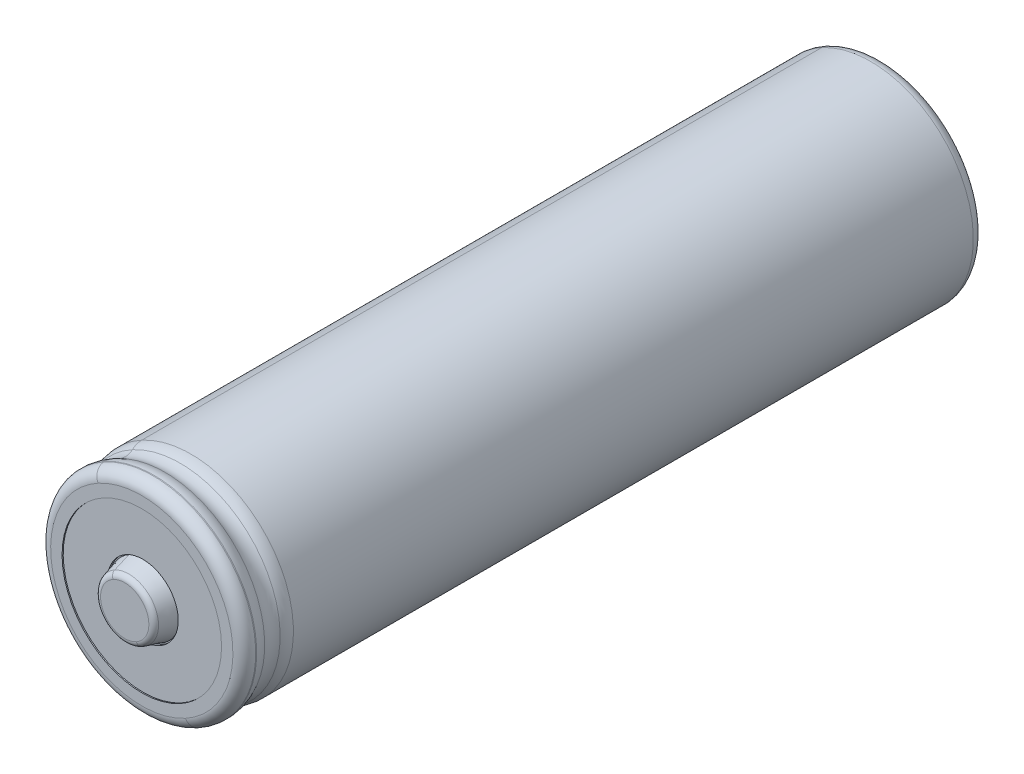
ISO-10303-21;
HEADER;
FILE_DESCRIPTION(('STEP AP214'),'2;1');
FILE_NAME('part.step','',(''),(''),'','','');
FILE_SCHEMA(('AUTOMOTIVE_DESIGN { 1 0 10303 214 1 1 1 1 }'));
ENDSEC;
DATA;
#1=APPLICATION_CONTEXT('core data for automotive mechanical design processes');
#2=APPLICATION_PROTOCOL_DEFINITION('international standard','automotive_design',2000,#1);
#3=PRODUCT_CONTEXT('',#1,'mechanical');
#4=PRODUCT('Part','Part','',(#3));
#5=PRODUCT_RELATED_PRODUCT_CATEGORY('part','',(#4));
#6=PRODUCT_DEFINITION_FORMATION('','',#4);
#7=PRODUCT_DEFINITION_CONTEXT('part definition',#1,'design');
#8=PRODUCT_DEFINITION('design','',#6,#7);
#9=PRODUCT_DEFINITION_SHAPE('','',#8);
#10=(LENGTH_UNIT() NAMED_UNIT(*) SI_UNIT(.MILLI.,.METRE.));
#11=(NAMED_UNIT(*) PLANE_ANGLE_UNIT() SI_UNIT($,.RADIAN.));
#12=(NAMED_UNIT(*) SI_UNIT($,.STERADIAN.) SOLID_ANGLE_UNIT());
#13=UNCERTAINTY_MEASURE_WITH_UNIT(LENGTH_MEASURE(1.E-05),#10,'distance_accuracy_value','');
#14=(GEOMETRIC_REPRESENTATION_CONTEXT(3) GLOBAL_UNCERTAINTY_ASSIGNED_CONTEXT((#13)) GLOBAL_UNIT_ASSIGNED_CONTEXT((#10,
#11,#12)) REPRESENTATION_CONTEXT('',''));
#15=CARTESIAN_POINT('',(0.,0.,0.));
#16=DIRECTION('',(0.,0.,1.));
#17=DIRECTION('',(1.,0.,0.));
#18=AXIS2_PLACEMENT_3D('',#15,#16,#17);
#19=CARTESIAN_POINT('',(0.,0.,-64.5));
#20=DIRECTION('',(0.,0.,1.));
#21=DIRECTION('',(-0.479425538604204,0.877582561890372,0.));
#22=AXIS2_PLACEMENT_3D('',#19,#20,#21);
#23=TOROIDAL_SURFACE('',#22,5.6,0.5);
#24=CARTESIAN_POINT('',(-2.68478301618,4.91446234659,-64.5));
#25=DIRECTION('',(-0.877582561890372,-0.479425538604204,0.));
#26=DIRECTION('',(0.479425538604204,-0.877582561890372,0.));
#27=AXIS2_PLACEMENT_3D('',#24,#25,#26);
#28=CIRCLE('',#27,0.5);
#29=CARTESIAN_POINT('',(-2.82861067776,5.17773711515,-64.9));
#30=VERTEX_POINT('',#29);
#31=CARTESIAN_POINT('',(-2.68478301618,4.91446234659,-65.));
#32=VERTEX_POINT('',#31);
#33=EDGE_CURVE('E11',#30,#32,#28,.T.);
#34=ORIENTED_EDGE('',*,*,#33,.T.);
#35=CARTESIAN_POINT('',(0.,0.,-65.));
#36=DIRECTION('',(0.,0.,1.));
#37=DIRECTION('',(1.,0.,0.));
#38=AXIS2_PLACEMENT_3D('',#35,#36,#37);
#39=CIRCLE('',#38,5.6);
#40=CARTESIAN_POINT('',(2.6847829205,-4.91446239886,-65.));
#41=VERTEX_POINT('',#40);
#42=EDGE_CURVE('E135',#32,#41,#39,.T.);
#43=ORIENTED_EDGE('',*,*,#42,.T.);
#44=CARTESIAN_POINT('',(2.68478315105,-4.91446227291,-64.5));
#45=DIRECTION('',(0.877582548733908,0.47942556268695,0.));
#46=DIRECTION('',(0.47942556268695,-0.877582548733908,0.));
#47=AXIS2_PLACEMENT_3D('',#44,#45,#46);
#48=CIRCLE('',#47,0.5);
#49=CARTESIAN_POINT('',(2.82861067776,-5.17773711515,-64.9));
#50=VERTEX_POINT('',#49);
#51=EDGE_CURVE('E25',#50,#41,#48,.T.);
#52=ORIENTED_EDGE('',*,*,#51,.F.);
#53=CARTESIAN_POINT('',(0.,0.,-64.9));
#54=DIRECTION('',(0.,0.,1.));
#55=DIRECTION('',(1.,0.,0.));
#56=AXIS2_PLACEMENT_3D('',#53,#54,#55);
#57=CIRCLE('',#56,5.9);
#58=EDGE_CURVE('E849',#30,#50,#57,.T.);
#59=ORIENTED_EDGE('',*,*,#58,.F.);
#60=EDGE_LOOP('',(#34,#43,#52,#59));
#61=FACE_BOUND('',#60,.T.);
#62=ADVANCED_FACE('F17',(#61),#23,.T.);
#63=CARTESIAN_POINT('',(4.79172257428E-13,0.,-64.5));
#64=DIRECTION('',(0.,0.,1.));
#65=DIRECTION('',(0.47942556268695,-0.877582548733908,0.));
#66=AXIS2_PLACEMENT_3D('',#63,#64,#65);
#67=TOROIDAL_SURFACE('',#66,5.6,0.5);
#68=ORIENTED_EDGE('',*,*,#51,.T.);
#69=CARTESIAN_POINT('',(0.,-1.46549439251E-13,-65.));
#70=DIRECTION('',(0.,0.,1.));
#71=DIRECTION('',(1.,0.,0.));
#72=AXIS2_PLACEMENT_3D('',#69,#70,#71);
#73=CIRCLE('',#72,5.6);
#74=EDGE_CURVE('E133',#41,#32,#73,.T.);
#75=ORIENTED_EDGE('',*,*,#74,.T.);
#76=ORIENTED_EDGE('',*,*,#33,.F.);
#77=CARTESIAN_POINT('',(0.,0.,-64.9));
#78=DIRECTION('',(0.,0.,1.));
#79=DIRECTION('',(1.,0.,0.));
#80=AXIS2_PLACEMENT_3D('',#77,#78,#79);
#81=CIRCLE('',#80,5.9);
#82=EDGE_CURVE('E845',#50,#30,#81,.T.);
#83=ORIENTED_EDGE('',*,*,#82,.F.);
#84=EDGE_LOOP('',(#68,#75,#76,#83));
#85=FACE_BOUND('',#84,.T.);
#86=ADVANCED_FACE('F205',(#85),#67,.T.);
#87=CARTESIAN_POINT('',(0.,5.9,-65.));
#88=DIRECTION('',(0.,0.,1.));
#89=DIRECTION('',(1.,0.,0.));
#90=AXIS2_PLACEMENT_3D('',#87,#88,#89);
#91=PLANE('',#90);
#92=ORIENTED_EDGE('',*,*,#42,.F.);
#93=ORIENTED_EDGE('',*,*,#74,.F.);
#94=EDGE_LOOP('',(#92,#93));
#95=FACE_BOUND('',#94,.T.);
#96=ADVANCED_FACE('F200',(#95),#91,.F.);
#97=CARTESIAN_POINT('',(0.,0.,1.));
#98=DIRECTION('',(0.,0.,1.));
#99=DIRECTION('',(-0.479425538604204,0.877582561890372,0.));
#100=AXIS2_PLACEMENT_3D('',#97,#98,#99);
#101=TOROIDAL_SURFACE('',#100,2.11995717521,0.5);
#102=CARTESIAN_POINT('',(-1.01636161055,1.86043744892,1.));
#103=DIRECTION('',(-0.877582561890372,-0.479425538604204,0.));
#104=DIRECTION('',(0.479425538604204,-0.877582561890372,0.));
#105=AXIS2_PLACEMENT_3D('',#102,#103,#104);
#106=CIRCLE('',#105,0.5);
#107=CARTESIAN_POINT('',(-1.01636161055,1.86043744892,1.5));
#108=VERTEX_POINT('',#107);
#109=CARTESIAN_POINT('',(-1.24732915693,2.2832207067,1.13382193189));
#110=VERTEX_POINT('',#109);
#111=EDGE_CURVE('E117',#108,#110,#106,.T.);
#112=ORIENTED_EDGE('',*,*,#111,.T.);
#113=CARTESIAN_POINT('',(0.,0.,1.13382193189));
#114=DIRECTION('',(0.,0.,1.));
#115=DIRECTION('',(1.,0.,0.));
#116=AXIS2_PLACEMENT_3D('',#113,#114,#115);
#117=CIRCLE('',#116,2.60171613003);
#118=CARTESIAN_POINT('',(1.24732915693,-2.2832207067,1.13382193189));
#119=VERTEX_POINT('',#118);
#120=EDGE_CURVE('E110',#110,#119,#117,.T.);
#121=ORIENTED_EDGE('',*,*,#120,.T.);
#122=CARTESIAN_POINT('',(1.01636161055,-1.86043744892,1.));
#123=DIRECTION('',(0.877582561890372,0.479425538604204,0.));
#124=DIRECTION('',(0.479425538604204,-0.877582561890372,0.));
#125=AXIS2_PLACEMENT_3D('',#122,#123,#124);
#126=CIRCLE('',#125,0.5);
#127=CARTESIAN_POINT('',(1.0163611056,-1.86043772477,1.5));
#128=VERTEX_POINT('',#127);
#129=EDGE_CURVE('E104',#128,#119,#126,.T.);
#130=ORIENTED_EDGE('',*,*,#129,.F.);
#131=CARTESIAN_POINT('',(0.,0.,1.5));
#132=DIRECTION('',(0.,0.,1.));
#133=DIRECTION('',(1.,0.,0.));
#134=AXIS2_PLACEMENT_3D('',#131,#132,#133);
#135=CIRCLE('',#134,2.11995717521);
#136=EDGE_CURVE('E107',#108,#128,#135,.T.);
#137=ORIENTED_EDGE('',*,*,#136,.F.);
#138=EDGE_LOOP('',(#112,#121,#130,#137));
#139=FACE_BOUND('',#138,.T.);
#140=ADVANCED_FACE('F106',(#139),#101,.T.);
#141=CARTESIAN_POINT('',(0.,0.,1.));
#142=DIRECTION('',(0.,0.,1.));
#143=DIRECTION('',(0.479425538604204,-0.877582561890372,0.));
#144=AXIS2_PLACEMENT_3D('',#141,#142,#143);
#145=TOROIDAL_SURFACE('',#144,2.11995717521,0.5);
#146=ORIENTED_EDGE('',*,*,#129,.T.);
#147=CARTESIAN_POINT('',(0.,0.,1.13382193189));
#148=DIRECTION('',(0.,0.,1.));
#149=DIRECTION('',(1.,0.,0.));
#150=AXIS2_PLACEMENT_3D('',#147,#148,#149);
#151=CIRCLE('',#150,2.60171613003);
#152=EDGE_CURVE('E126',#119,#110,#151,.T.);
#153=ORIENTED_EDGE('',*,*,#152,.T.);
#154=ORIENTED_EDGE('',*,*,#111,.F.);
#155=CARTESIAN_POINT('',(0.,0.,1.5));
#156=DIRECTION('',(0.,0.,1.));
#157=DIRECTION('',(1.,0.,0.));
#158=AXIS2_PLACEMENT_3D('',#155,#156,#157);
#159=CIRCLE('',#158,2.11995717521);
#160=EDGE_CURVE('E121',#128,#108,#159,.T.);
#161=ORIENTED_EDGE('',*,*,#160,.F.);
#162=EDGE_LOOP('',(#146,#153,#154,#161));
#163=FACE_BOUND('',#162,.T.);
#164=ADVANCED_FACE('F124',(#163),#145,.T.);
#165=CARTESIAN_POINT('',(0.,2.5,1.5));
#166=DIRECTION('',(0.,0.,1.));
#167=DIRECTION('',(1.,0.,0.));
#168=AXIS2_PLACEMENT_3D('',#165,#166,#167);
#169=PLANE('',#168);
#170=ORIENTED_EDGE('',*,*,#160,.T.);
#171=ORIENTED_EDGE('',*,*,#136,.T.);
#172=EDGE_LOOP('',(#170,#171));
#173=FACE_BOUND('',#172,.T.);
#174=ADVANCED_FACE('F120',(#173),#169,.T.);
#175=CARTESIAN_POINT('',(0.,0.,1.5));
#176=DIRECTION('',(0.,0.,-1.));
#177=DIRECTION('',(-0.479425538604204,0.877582561890372,0.));
#178=AXIS2_PLACEMENT_3D('',#175,#176,#177);
#179=CONICAL_SURFACE('',#178,2.5,0.270946850338);
#180=DIRECTION('',(-0.128315303549978,0.23487958765596,0.963517909629833));
#181=VECTOR('',#180,1.);
#182=CARTESIAN_POINT('',(1.34280288637,-2.45798419619,0.416910965947));
#183=LINE('',#182,#181);
#184=CARTESIAN_POINT('',(1.43827661581,-2.63274768567,-0.3));
#185=VERTEX_POINT('',#184);
#186=EDGE_CURVE('E740',#185,#119,#183,.T.);
#187=ORIENTED_EDGE('',*,*,#186,.F.);
#188=CARTESIAN_POINT('',(0.,0.,-0.3));
#189=DIRECTION('',(0.,0.,1.));
#190=DIRECTION('',(1.,0.,0.));
#191=AXIS2_PLACEMENT_3D('',#188,#189,#190);
#192=CIRCLE('',#191,3.);
#193=CARTESIAN_POINT('',(-1.43827661581,2.63274768567,-0.3));
#194=VERTEX_POINT('',#193);
#195=EDGE_CURVE('E842',#185,#194,#192,.T.);
#196=ORIENTED_EDGE('',*,*,#195,.T.);
#197=DIRECTION('',(0.128315303549978,-0.23487958765596,0.963517909629833));
#198=VECTOR('',#197,1.);
#199=CARTESIAN_POINT('',(-1.34280288637,2.45798419619,0.416910965947));
#200=LINE('',#199,#198);
#201=EDGE_CURVE('E739',#194,#110,#200,.T.);
#202=ORIENTED_EDGE('',*,*,#201,.T.);
#203=ORIENTED_EDGE('',*,*,#152,.F.);
#204=EDGE_LOOP('',(#187,#196,#202,#203));
#205=FACE_BOUND('',#204,.T.);
#206=ADVANCED_FACE('F477',(#205),#179,.T.);
#207=CARTESIAN_POINT('',(0.,0.,1.5));
#208=DIRECTION('',(0.,0.,-1.));
#209=DIRECTION('',(-0.479425538604204,0.877582561890372,0.));
#210=AXIS2_PLACEMENT_3D('',#207,#208,#209);
#211=CONICAL_SURFACE('',#210,2.5,0.270946850338);
#212=ORIENTED_EDGE('',*,*,#201,.F.);
#213=CARTESIAN_POINT('',(0.,0.,-0.3));
#214=DIRECTION('',(0.,0.,1.));
#215=DIRECTION('',(1.,0.,0.));
#216=AXIS2_PLACEMENT_3D('',#213,#214,#215);
#217=CIRCLE('',#216,3.);
#218=EDGE_CURVE('E839',#194,#185,#217,.T.);
#219=ORIENTED_EDGE('',*,*,#218,.T.);
#220=ORIENTED_EDGE('',*,*,#186,.T.);
#221=ORIENTED_EDGE('',*,*,#120,.F.);
#222=EDGE_LOOP('',(#212,#219,#220,#221));
#223=FACE_BOUND('',#222,.T.);
#224=ADVANCED_FACE('F465',(#223),#211,.T.);
#225=CARTESIAN_POINT('',(0.,0.,-64.));
#226=DIRECTION('',(0.,0.,1.));
#227=DIRECTION('',(-0.479425538604204,0.877582561890372,0.));
#228=AXIS2_PLACEMENT_3D('',#225,#226,#227);
#229=TOROIDAL_SURFACE('',#228,8.,1.);
#230=CARTESIAN_POINT('',(-3.83540430883,7.02066049512,-64.));
#231=DIRECTION('',(-0.877582561890372,-0.479425538604204,0.));
#232=DIRECTION('',(0.479425538604204,-0.877582561890372,0.));
#233=AXIS2_PLACEMENT_3D('',#230,#231,#232);
#234=CIRCLE('',#233,1.);
#235=CARTESIAN_POINT('',(-4.31482984744,7.89824305701,-64.));
#236=VERTEX_POINT('',#235);
#237=CARTESIAN_POINT('',(-3.83540430883,7.02066049512,-65.));
#238=VERTEX_POINT('',#237);
#239=EDGE_CURVE('E736',#236,#238,#234,.T.);
#240=ORIENTED_EDGE('',*,*,#239,.T.);
#241=CARTESIAN_POINT('',(0.,0.,-65.));
#242=DIRECTION('',(0.,0.,1.));
#243=DIRECTION('',(1.,0.,0.));
#244=AXIS2_PLACEMENT_3D('',#241,#242,#243);
#245=CIRCLE('',#244,8.);
#246=CARTESIAN_POINT('',(3.83540408046,-7.02066061988,-65.));
#247=VERTEX_POINT('',#246);
#248=EDGE_CURVE('E711',#238,#247,#245,.T.);
#249=ORIENTED_EDGE('',*,*,#248,.T.);
#250=CARTESIAN_POINT('',(3.83540423868,-7.02066053345,-64.));
#251=DIRECTION('',(0.877582566681008,0.479425529835004,0.));
#252=DIRECTION('',(0.479425529835004,-0.877582566681008,0.));
#253=AXIS2_PLACEMENT_3D('',#250,#251,#252);
#254=CIRCLE('',#253,1.);
#255=CARTESIAN_POINT('',(4.31482984744,-7.89824305701,-64.));
#256=VERTEX_POINT('',#255);
#257=EDGE_CURVE('E733',#256,#247,#254,.T.);
#258=ORIENTED_EDGE('',*,*,#257,.F.);
#259=CARTESIAN_POINT('',(0.,0.,-64.));
#260=DIRECTION('',(0.,0.,1.));
#261=DIRECTION('',(1.,0.,0.));
#262=AXIS2_PLACEMENT_3D('',#259,#260,#261);
#263=CIRCLE('',#262,9.);
#264=EDGE_CURVE('E725',#236,#256,#263,.T.);
#265=ORIENTED_EDGE('',*,*,#264,.F.);
#266=EDGE_LOOP('',(#240,#249,#258,#265));
#267=FACE_BOUND('',#266,.T.);
#268=ADVANCED_FACE('F453',(#267),#229,.T.);
#269=CARTESIAN_POINT('',(0.,0.,-64.));
#270=DIRECTION('',(0.,0.,1.));
#271=DIRECTION('',(0.479425529835004,-0.877582566681008,0.));
#272=AXIS2_PLACEMENT_3D('',#269,#270,#271);
#273=TOROIDAL_SURFACE('',#272,8.,1.);
#274=ORIENTED_EDGE('',*,*,#257,.T.);
#275=CARTESIAN_POINT('',(0.,0.,-65.));
#276=DIRECTION('',(0.,0.,1.));
#277=DIRECTION('',(1.,0.,0.));
#278=AXIS2_PLACEMENT_3D('',#275,#276,#277);
#279=CIRCLE('',#278,8.);
#280=EDGE_CURVE('E715',#247,#238,#279,.T.);
#281=ORIENTED_EDGE('',*,*,#280,.T.);
#282=ORIENTED_EDGE('',*,*,#239,.F.);
#283=CARTESIAN_POINT('',(0.,0.,-64.));
#284=DIRECTION('',(0.,0.,1.));
#285=DIRECTION('',(1.,0.,0.));
#286=AXIS2_PLACEMENT_3D('',#283,#284,#285);
#287=CIRCLE('',#286,9.);
#288=EDGE_CURVE('E729',#256,#236,#287,.T.);
#289=ORIENTED_EDGE('',*,*,#288,.F.);
#290=EDGE_LOOP('',(#274,#281,#282,#289));
#291=FACE_BOUND('',#290,.T.);
#292=ADVANCED_FACE('F441',(#291),#273,.T.);
#293=CARTESIAN_POINT('',(0.,0.,-31.75));
#294=DIRECTION('',(0.,0.,1.));
#295=DIRECTION('',(0.479425538604204,-0.877582561890372,0.));
#296=AXIS2_PLACEMENT_3D('',#293,#294,#295);
#297=CYLINDRICAL_SURFACE('',#296,9.);
#298=DIRECTION('',(0.,0.,1.));
#299=VECTOR('',#298,1.);
#300=CARTESIAN_POINT('',(-4.31482984744,7.89824305701,-34.156132875));
#301=LINE('',#300,#299);
#302=CARTESIAN_POINT('',(-4.31482984744,7.89824305701,-4.31226575006));
#303=VERTEX_POINT('',#302);
#304=EDGE_CURVE('E722',#236,#303,#301,.T.);
#305=ORIENTED_EDGE('',*,*,#304,.T.);
#306=CARTESIAN_POINT('',(0.,0.,-4.31226575006));
#307=DIRECTION('',(0.,0.,1.));
#308=DIRECTION('',(1.,0.,0.));
#309=AXIS2_PLACEMENT_3D('',#306,#307,#308);
#310=CIRCLE('',#309,9.);
#311=CARTESIAN_POINT('',(4.31482984744,-7.89824305701,-4.31226575006));
#312=VERTEX_POINT('',#311);
#313=EDGE_CURVE('E799',#312,#303,#310,.T.);
#314=ORIENTED_EDGE('',*,*,#313,.F.);
#315=DIRECTION('',(0.,0.,1.));
#316=VECTOR('',#315,1.);
#317=CARTESIAN_POINT('',(4.31482984744,-7.89824305701,-34.156132875));
#318=LINE('',#317,#316);
#319=EDGE_CURVE('E719',#256,#312,#318,.T.);
#320=ORIENTED_EDGE('',*,*,#319,.F.);
#321=ORIENTED_EDGE('',*,*,#288,.T.);
#322=EDGE_LOOP('',(#305,#314,#320,#321));
#323=FACE_BOUND('',#322,.T.);
#324=ADVANCED_FACE('F429',(#323),#297,.T.);
#325=CARTESIAN_POINT('',(0.,0.,-31.75));
#326=DIRECTION('',(0.,0.,1.));
#327=DIRECTION('',(0.479425538604204,-0.877582561890372,0.));
#328=AXIS2_PLACEMENT_3D('',#325,#326,#327);
#329=CYLINDRICAL_SURFACE('',#328,9.);
#330=ORIENTED_EDGE('',*,*,#319,.T.);
#331=CARTESIAN_POINT('',(0.,0.,-4.31226575006));
#332=DIRECTION('',(0.,0.,1.));
#333=DIRECTION('',(1.,0.,0.));
#334=AXIS2_PLACEMENT_3D('',#331,#332,#333);
#335=CIRCLE('',#334,9.);
#336=EDGE_CURVE('E673',#303,#312,#335,.T.);
#337=ORIENTED_EDGE('',*,*,#336,.F.);
#338=ORIENTED_EDGE('',*,*,#304,.F.);
#339=ORIENTED_EDGE('',*,*,#264,.T.);
#340=EDGE_LOOP('',(#330,#337,#338,#339));
#341=FACE_BOUND('',#340,.T.);
#342=ADVANCED_FACE('F417',(#341),#329,.T.);
#343=CARTESIAN_POINT('',(0.,5.9,-65.));
#344=DIRECTION('',(0.,0.,1.));
#345=DIRECTION('',(1.,0.,0.));
#346=AXIS2_PLACEMENT_3D('',#343,#344,#345);
#347=PLANE('',#346);
#348=CARTESIAN_POINT('',(0.,0.,-65.));
#349=DIRECTION('',(0.,0.,1.));
#350=DIRECTION('',(1.,0.,0.));
#351=AXIS2_PLACEMENT_3D('',#348,#349,#350);
#352=CIRCLE('',#351,6.);
#353=CARTESIAN_POINT('',(2.87655323163,-5.26549537134,-65.));
#354=VERTEX_POINT('',#353);
#355=CARTESIAN_POINT('',(-2.87655323163,5.26549537134,-65.));
#356=VERTEX_POINT('',#355);
#357=EDGE_CURVE('E833',#354,#356,#352,.T.);
#358=ORIENTED_EDGE('',*,*,#357,.T.);
#359=CARTESIAN_POINT('',(0.,0.,-65.));
#360=DIRECTION('',(0.,0.,1.));
#361=DIRECTION('',(1.,0.,0.));
#362=AXIS2_PLACEMENT_3D('',#359,#360,#361);
#363=CIRCLE('',#362,6.);
#364=EDGE_CURVE('E813',#356,#354,#363,.T.);
#365=ORIENTED_EDGE('',*,*,#364,.T.);
#366=EDGE_LOOP('',(#358,#365));
#367=FACE_BOUND('',#366,.T.);
#368=ORIENTED_EDGE('',*,*,#248,.F.);
#369=ORIENTED_EDGE('',*,*,#280,.F.);
#370=EDGE_LOOP('',(#368,#369));
#371=FACE_BOUND('',#370,.T.);
#372=ADVANCED_FACE('F405',(#367,#371),#347,.F.);
#373=CARTESIAN_POINT('',(0.,0.,-1.));
#374=DIRECTION('',(0.,0.,1.));
#375=DIRECTION('',(-0.479425538604204,0.877582561890372,0.));
#376=AXIS2_PLACEMENT_3D('',#373,#374,#375);
#377=TOROIDAL_SURFACE('',#376,8.,1.);
#378=CARTESIAN_POINT('',(-3.83540430883,7.02066049512,-1.));
#379=DIRECTION('',(-0.877582561890372,-0.479425538604204,0.));
#380=DIRECTION('',(0.479425538604204,-0.877582561890372,0.));
#381=AXIS2_PLACEMENT_3D('',#378,#379,#380);
#382=CIRCLE('',#381,1.);
#383=CARTESIAN_POINT('',(-3.83540430883,7.02066049512,0.));
#384=VERTEX_POINT('',#383);
#385=CARTESIAN_POINT('',(-4.31482984744,7.89824305701,-1.));
#386=VERTEX_POINT('',#385);
#387=EDGE_CURVE('E708',#384,#386,#382,.T.);
#388=ORIENTED_EDGE('',*,*,#387,.T.);
#389=CARTESIAN_POINT('',(0.,0.,-1.));
#390=DIRECTION('',(0.,0.,1.));
#391=DIRECTION('',(1.,0.,0.));
#392=AXIS2_PLACEMENT_3D('',#389,#390,#391);
#393=CIRCLE('',#392,9.);
#394=CARTESIAN_POINT('',(4.31482984744,-7.89824305701,-1.));
#395=VERTEX_POINT('',#394);
#396=EDGE_CURVE('E697',#386,#395,#393,.T.);
#397=ORIENTED_EDGE('',*,*,#396,.T.);
#398=CARTESIAN_POINT('',(3.83540430883,-7.02066049512,-1.));
#399=DIRECTION('',(0.877582561890372,0.479425538604204,0.));
#400=DIRECTION('',(0.479425538604204,-0.877582561890372,0.));
#401=AXIS2_PLACEMENT_3D('',#398,#399,#400);
#402=CIRCLE('',#401,1.);
#403=CARTESIAN_POINT('',(3.83540408046,-7.02066061988,0.));
#404=VERTEX_POINT('',#403);
#405=EDGE_CURVE('E705',#404,#395,#402,.T.);
#406=ORIENTED_EDGE('',*,*,#405,.F.);
#407=CARTESIAN_POINT('',(0.,0.,0.));
#408=DIRECTION('',(0.,0.,1.));
#409=DIRECTION('',(1.,0.,0.));
#410=AXIS2_PLACEMENT_3D('',#407,#408,#409);
#411=CIRCLE('',#410,8.);
#412=EDGE_CURVE('E688',#384,#404,#411,.T.);
#413=ORIENTED_EDGE('',*,*,#412,.F.);
#414=EDGE_LOOP('',(#388,#397,#406,#413));
#415=FACE_BOUND('',#414,.T.);
#416=ADVANCED_FACE('F393',(#415),#377,.T.);
#417=CARTESIAN_POINT('',(0.,0.,-1.));
#418=DIRECTION('',(0.,0.,1.));
#419=DIRECTION('',(0.479425538604204,-0.877582561890372,0.));
#420=AXIS2_PLACEMENT_3D('',#417,#418,#419);
#421=TOROIDAL_SURFACE('',#420,8.,1.);
#422=ORIENTED_EDGE('',*,*,#405,.T.);
#423=CARTESIAN_POINT('',(0.,0.,-1.));
#424=DIRECTION('',(0.,0.,1.));
#425=DIRECTION('',(1.,0.,0.));
#426=AXIS2_PLACEMENT_3D('',#423,#424,#425);
#427=CIRCLE('',#426,9.);
#428=EDGE_CURVE('E701',#395,#386,#427,.T.);
#429=ORIENTED_EDGE('',*,*,#428,.T.);
#430=ORIENTED_EDGE('',*,*,#387,.F.);
#431=CARTESIAN_POINT('',(0.,0.,0.));
#432=DIRECTION('',(0.,0.,1.));
#433=DIRECTION('',(1.,0.,0.));
#434=AXIS2_PLACEMENT_3D('',#431,#432,#433);
#435=CIRCLE('',#434,8.);
#436=EDGE_CURVE('E687',#404,#384,#435,.T.);
#437=ORIENTED_EDGE('',*,*,#436,.F.);
#438=EDGE_LOOP('',(#422,#429,#430,#437));
#439=FACE_BOUND('',#438,.T.);
#440=ADVANCED_FACE('F381',(#439),#421,.T.);
#441=CARTESIAN_POINT('',(0.,0.,-31.75));
#442=DIRECTION('',(0.,0.,1.));
#443=DIRECTION('',(0.479425538604204,-0.877582561890372,0.));
#444=AXIS2_PLACEMENT_3D('',#441,#442,#443);
#445=CYLINDRICAL_SURFACE('',#444,9.);
#446=DIRECTION('',(0.,0.,1.));
#447=VECTOR('',#446,1.);
#448=CARTESIAN_POINT('',(4.31482984744,-7.89824305701,-34.156132875));
#449=LINE('',#448,#447);
#450=CARTESIAN_POINT('',(4.31482984744,-7.89824305701,-1.08736265074));
#451=VERTEX_POINT('',#450);
#452=EDGE_CURVE('E696',#451,#395,#449,.T.);
#453=ORIENTED_EDGE('',*,*,#452,.F.);
#454=CARTESIAN_POINT('',(0.,0.,-1.08736265074));
#455=DIRECTION('',(0.,0.,1.));
#456=DIRECTION('',(1.,0.,0.));
#457=AXIS2_PLACEMENT_3D('',#454,#455,#456);
#458=CIRCLE('',#457,9.);
#459=CARTESIAN_POINT('',(-4.31482984744,7.89824305701,-1.08736265074));
#460=VERTEX_POINT('',#459);
#461=EDGE_CURVE('E647',#451,#460,#458,.T.);
#462=ORIENTED_EDGE('',*,*,#461,.T.);
#463=DIRECTION('',(0.,0.,1.));
#464=VECTOR('',#463,1.);
#465=CARTESIAN_POINT('',(-4.31482984744,7.89824305701,-34.156132875));
#466=LINE('',#465,#464);
#467=EDGE_CURVE('E692',#460,#386,#466,.T.);
#468=ORIENTED_EDGE('',*,*,#467,.T.);
#469=ORIENTED_EDGE('',*,*,#428,.F.);
#470=EDGE_LOOP('',(#453,#462,#468,#469));
#471=FACE_BOUND('',#470,.T.);
#472=ADVANCED_FACE('F369',(#471),#445,.T.);
#473=CARTESIAN_POINT('',(0.,0.,-31.75));
#474=DIRECTION('',(0.,0.,1.));
#475=DIRECTION('',(0.479425538604204,-0.877582561890372,0.));
#476=AXIS2_PLACEMENT_3D('',#473,#474,#475);
#477=CYLINDRICAL_SURFACE('',#476,9.);
#478=ORIENTED_EDGE('',*,*,#467,.F.);
#479=CARTESIAN_POINT('',(0.,0.,-1.08736265074));
#480=DIRECTION('',(0.,0.,1.));
#481=DIRECTION('',(1.,0.,0.));
#482=AXIS2_PLACEMENT_3D('',#479,#480,#481);
#483=CIRCLE('',#482,9.);
#484=EDGE_CURVE('E683',#460,#451,#483,.T.);
#485=ORIENTED_EDGE('',*,*,#484,.T.);
#486=ORIENTED_EDGE('',*,*,#452,.T.);
#487=ORIENTED_EDGE('',*,*,#396,.F.);
#488=EDGE_LOOP('',(#478,#485,#486,#487));
#489=FACE_BOUND('',#488,.T.);
#490=ADVANCED_FACE('F357',(#489),#477,.T.);
#491=CARTESIAN_POINT('',(0.,7.,0.));
#492=DIRECTION('',(0.,0.,1.));
#493=DIRECTION('',(1.,0.,0.));
#494=AXIS2_PLACEMENT_3D('',#491,#492,#493);
#495=PLANE('',#494);
#496=CARTESIAN_POINT('',(0.,0.,0.));
#497=DIRECTION('',(0.,0.,1.));
#498=DIRECTION('',(1.,0.,0.));
#499=AXIS2_PLACEMENT_3D('',#496,#497,#498);
#500=CIRCLE('',#499,7.);
#501=CARTESIAN_POINT('',(-3.35597877023,6.14307793323,0.));
#502=VERTEX_POINT('',#501);
#503=CARTESIAN_POINT('',(3.35597877023,-6.14307793323,0.));
#504=VERTEX_POINT('',#503);
#505=EDGE_CURVE('E781',#502,#504,#500,.T.);
#506=ORIENTED_EDGE('',*,*,#505,.F.);
#507=CARTESIAN_POINT('',(0.,0.,0.));
#508=DIRECTION('',(0.,0.,1.));
#509=DIRECTION('',(1.,0.,0.));
#510=AXIS2_PLACEMENT_3D('',#507,#508,#509);
#511=CIRCLE('',#510,7.);
#512=EDGE_CURVE('E787',#504,#502,#511,.T.);
#513=ORIENTED_EDGE('',*,*,#512,.F.);
#514=EDGE_LOOP('',(#506,#513));
#515=FACE_BOUND('',#514,.T.);
#516=ORIENTED_EDGE('',*,*,#436,.T.);
#517=ORIENTED_EDGE('',*,*,#412,.T.);
#518=EDGE_LOOP('',(#516,#517));
#519=FACE_BOUND('',#518,.T.);
#520=ADVANCED_FACE('F243',(#515,#519),#495,.T.);
#521=CARTESIAN_POINT('',(0.,0.,-1.08736265074));
#522=DIRECTION('',(0.,0.,1.));
#523=DIRECTION('',(-0.479425538604204,0.877582561890373,0.));
#524=AXIS2_PLACEMENT_3D('',#521,#522,#523);
#525=TOROIDAL_SURFACE('',#524,7.,2.);
#526=CARTESIAN_POINT('',(-3.35597877023,6.14307793323,-1.08736265074));
#527=DIRECTION('',(-0.877582561890372,-0.479425538604204,0.));
#528=DIRECTION('',(0.479425538604204,-0.877582561890372,0.));
#529=AXIS2_PLACEMENT_3D('',#526,#527,#528);
#530=CIRCLE('',#529,2.);
#531=CARTESIAN_POINT('',(-4.20365870805,7.69474565136,-2.02211717228));
#532=VERTEX_POINT('',#531);
#533=EDGE_CURVE('E651',#460,#532,#530,.T.);
#534=ORIENTED_EDGE('',*,*,#533,.T.);
#535=CARTESIAN_POINT('',(0.,0.,-2.02211717228));
#536=DIRECTION('',(0.,0.,1.));
#537=DIRECTION('',(1.,0.,0.));
#538=AXIS2_PLACEMENT_3D('',#535,#536,#537);
#539=CIRCLE('',#538,8.76811594203);
#540=CARTESIAN_POINT('',(4.20365870805,-7.69474565136,-2.02211717228));
#541=VERTEX_POINT('',#540);
#542=EDGE_CURVE('E661',#532,#541,#539,.T.);
#543=ORIENTED_EDGE('',*,*,#542,.T.);
#544=CARTESIAN_POINT('',(3.35597877023,-6.14307793323,-1.08736265074));
#545=DIRECTION('',(0.877582561890372,0.479425538604204,0.));
#546=DIRECTION('',(0.479425538604204,-0.877582561890372,0.));
#547=AXIS2_PLACEMENT_3D('',#544,#545,#546);
#548=CIRCLE('',#547,2.);
#549=EDGE_CURVE('E641',#451,#541,#548,.T.);
#550=ORIENTED_EDGE('',*,*,#549,.F.);
#551=ORIENTED_EDGE('',*,*,#484,.F.);
#552=EDGE_LOOP('',(#534,#543,#550,#551));
#553=FACE_BOUND('',#552,.T.);
#554=ADVANCED_FACE('F220',(#553),#525,.T.);
#555=CARTESIAN_POINT('',(0.,0.,-1.08736265074));
#556=DIRECTION('',(0.,0.,1.));
#557=DIRECTION('',(0.479425538604204,-0.877582561890373,0.));
#558=AXIS2_PLACEMENT_3D('',#555,#556,#557);
#559=TOROIDAL_SURFACE('',#558,7.,2.);
#560=ORIENTED_EDGE('',*,*,#549,.T.);
#561=CARTESIAN_POINT('',(0.,0.,-2.02211717228));
#562=DIRECTION('',(0.,0.,1.));
#563=DIRECTION('',(1.,0.,0.));
#564=AXIS2_PLACEMENT_3D('',#561,#562,#563);
#565=CIRCLE('',#564,8.76811594203);
#566=EDGE_CURVE('E644',#541,#532,#565,.T.);
#567=ORIENTED_EDGE('',*,*,#566,.T.);
#568=ORIENTED_EDGE('',*,*,#533,.F.);
#569=ORIENTED_EDGE('',*,*,#461,.F.);
#570=EDGE_LOOP('',(#560,#567,#568,#569));
#571=FACE_BOUND('',#570,.T.);
#572=ADVANCED_FACE('F214',(#571),#559,.T.);
#573=CARTESIAN_POINT('',(0.,0.,-2.6998142004));
#574=DIRECTION('',(0.,0.,1.));
#575=DIRECTION('',(0.479425538604203,-0.877582561890373,0.));
#576=AXIS2_PLACEMENT_3D('',#573,#574,#575);
#577=TOROIDAL_SURFACE('',#576,10.05,1.45);
#578=ORIENTED_EDGE('',*,*,#566,.F.);
#579=CARTESIAN_POINT('',(4.81822666297,-8.819704747,-2.6998142004));
#580=DIRECTION('',(0.877582561890372,0.479425538604204,0.));
#581=DIRECTION('',(0.479425538604204,-0.877582561890372,0.));
#582=AXIS2_PLACEMENT_3D('',#579,#580,#581);
#583=CIRCLE('',#582,1.45);
#584=CARTESIAN_POINT('',(4.20365870805,-7.69474565136,-3.37751122852));
#585=VERTEX_POINT('',#584);
#586=EDGE_CURVE('E655',#585,#541,#583,.T.);
#587=ORIENTED_EDGE('',*,*,#586,.F.);
#588=CARTESIAN_POINT('',(0.,0.,-3.37751122852));
#589=DIRECTION('',(0.,0.,1.));
#590=DIRECTION('',(1.,0.,0.));
#591=AXIS2_PLACEMENT_3D('',#588,#589,#590);
#592=CIRCLE('',#591,8.76811594203);
#593=CARTESIAN_POINT('',(-4.20365870805,7.69474565136,-3.37751122852));
#594=VERTEX_POINT('',#593);
#595=EDGE_CURVE('E859',#585,#594,#592,.T.);
#596=ORIENTED_EDGE('',*,*,#595,.T.);
#597=CARTESIAN_POINT('',(-4.81822666297,8.819704747,-2.6998142004));
#598=DIRECTION('',(-0.877582561890372,-0.479425538604204,0.));
#599=DIRECTION('',(0.479425538604204,-0.877582561890372,0.));
#600=AXIS2_PLACEMENT_3D('',#597,#598,#599);
#601=CIRCLE('',#600,1.45);
#602=EDGE_CURVE('E657',#594,#532,#601,.T.);
#603=ORIENTED_EDGE('',*,*,#602,.T.);
#604=EDGE_LOOP('',(#578,#587,#596,#603));
#605=FACE_BOUND('',#604,.T.);
#606=ADVANCED_FACE('F219',(#605),#577,.F.);
#607=CARTESIAN_POINT('',(0.,0.,-2.6998142004));
#608=DIRECTION('',(0.,0.,1.));
#609=DIRECTION('',(0.479425538604203,-0.877582561890373,0.));
#610=AXIS2_PLACEMENT_3D('',#607,#608,#609);
#611=TOROIDAL_SURFACE('',#610,10.05,1.45);
#612=ORIENTED_EDGE('',*,*,#542,.F.);
#613=ORIENTED_EDGE('',*,*,#602,.F.);
#614=CARTESIAN_POINT('',(0.,0.,-3.37751122852));
#615=DIRECTION('',(0.,0.,1.));
#616=DIRECTION('',(1.,0.,0.));
#617=AXIS2_PLACEMENT_3D('',#614,#615,#616);
#618=CIRCLE('',#617,8.76811594203);
#619=EDGE_CURVE('E663',#594,#585,#618,.T.);
#620=ORIENTED_EDGE('',*,*,#619,.T.);
#621=ORIENTED_EDGE('',*,*,#586,.T.);
#622=EDGE_LOOP('',(#612,#613,#620,#621));
#623=FACE_BOUND('',#622,.T.);
#624=ADVANCED_FACE('F265',(#623),#611,.F.);
#625=CARTESIAN_POINT('',(0.,0.,-4.31226575006));
#626=DIRECTION('',(0.,0.,1.));
#627=DIRECTION('',(-0.479425538604204,0.877582561890373,0.));
#628=AXIS2_PLACEMENT_3D('',#625,#626,#627);
#629=TOROIDAL_SURFACE('',#628,7.,2.);
#630=CARTESIAN_POINT('',(-3.35597877023,6.14307793323,-4.31226575006));
#631=DIRECTION('',(-0.877582561890372,-0.479425538604204,0.));
#632=DIRECTION('',(0.479425538604204,-0.877582561890372,0.));
#633=AXIS2_PLACEMENT_3D('',#630,#631,#632);
#634=CIRCLE('',#633,2.);
#635=EDGE_CURVE('E803',#594,#303,#634,.T.);
#636=ORIENTED_EDGE('',*,*,#635,.T.);
#637=ORIENTED_EDGE('',*,*,#336,.T.);
#638=CARTESIAN_POINT('',(3.35597877023,-6.14307793323,-4.31226575006));
#639=DIRECTION('',(0.877582561890372,0.479425538604204,0.));
#640=DIRECTION('',(0.479425538604204,-0.877582561890372,0.));
#641=AXIS2_PLACEMENT_3D('',#638,#639,#640);
#642=CIRCLE('',#641,2.);
#643=EDGE_CURVE('E804',#585,#312,#642,.T.);
#644=ORIENTED_EDGE('',*,*,#643,.F.);
#645=ORIENTED_EDGE('',*,*,#619,.F.);
#646=EDGE_LOOP('',(#636,#637,#644,#645));
#647=FACE_BOUND('',#646,.T.);
#648=ADVANCED_FACE('F325',(#647),#629,.T.);
#649=CARTESIAN_POINT('',(0.,0.,-4.31226575006));
#650=DIRECTION('',(0.,0.,1.));
#651=DIRECTION('',(0.479425538604204,-0.877582561890373,0.));
#652=AXIS2_PLACEMENT_3D('',#649,#650,#651);
#653=TOROIDAL_SURFACE('',#652,7.,2.);
#654=ORIENTED_EDGE('',*,*,#643,.T.);
#655=ORIENTED_EDGE('',*,*,#313,.T.);
#656=ORIENTED_EDGE('',*,*,#635,.F.);
#657=ORIENTED_EDGE('',*,*,#595,.F.);
#658=EDGE_LOOP('',(#654,#655,#656,#657));
#659=FACE_BOUND('',#658,.T.);
#660=ADVANCED_FACE('F292',(#659),#653,.T.);
#661=CARTESIAN_POINT('',(0.,6.,-64.9));
#662=DIRECTION('',(0.,0.,1.));
#663=DIRECTION('',(1.,0.,0.));
#664=AXIS2_PLACEMENT_3D('',#661,#662,#663);
#665=PLANE('',#664);
#666=ORIENTED_EDGE('',*,*,#82,.T.);
#667=ORIENTED_EDGE('',*,*,#58,.T.);
#668=EDGE_LOOP('',(#666,#667));
#669=FACE_BOUND('',#668,.T.);
#670=CARTESIAN_POINT('',(0.,0.,-64.9));
#671=DIRECTION('',(0.,0.,1.));
#672=DIRECTION('',(1.,0.,0.));
#673=AXIS2_PLACEMENT_3D('',#670,#671,#672);
#674=CIRCLE('',#673,6.);
#675=CARTESIAN_POINT('',(-2.87655323163,5.26549537134,-64.9));
#676=VERTEX_POINT('',#675);
#677=CARTESIAN_POINT('',(2.87655323163,-5.26549537134,-64.9));
#678=VERTEX_POINT('',#677);
#679=EDGE_CURVE('E825',#676,#678,#674,.T.);
#680=ORIENTED_EDGE('',*,*,#679,.F.);
#681=CARTESIAN_POINT('',(0.,0.,-64.9));
#682=DIRECTION('',(0.,0.,1.));
#683=DIRECTION('',(1.,0.,0.));
#684=AXIS2_PLACEMENT_3D('',#681,#682,#683);
#685=CIRCLE('',#684,6.);
#686=EDGE_CURVE('E836',#678,#676,#685,.T.);
#687=ORIENTED_EDGE('',*,*,#686,.F.);
#688=EDGE_LOOP('',(#680,#687));
#689=FACE_BOUND('',#688,.T.);
#690=ADVANCED_FACE('F286',(#669,#689),#665,.F.);
#691=CARTESIAN_POINT('',(0.,3.1,-0.3));
#692=DIRECTION('',(0.,0.,1.));
#693=DIRECTION('',(1.,0.,0.));
#694=AXIS2_PLACEMENT_3D('',#691,#692,#693);
#695=PLANE('',#694);
#696=ORIENTED_EDGE('',*,*,#218,.F.);
#697=ORIENTED_EDGE('',*,*,#195,.F.);
#698=EDGE_LOOP('',(#696,#697));
#699=FACE_BOUND('',#698,.T.);
#700=CARTESIAN_POINT('',(0.,0.,-0.3));
#701=DIRECTION('',(0.,0.,1.));
#702=DIRECTION('',(1.,0.,0.));
#703=AXIS2_PLACEMENT_3D('',#700,#701,#702);
#704=CIRCLE('',#703,3.1);
#705=CARTESIAN_POINT('',(1.48621916967,-2.72050594186,-0.3));
#706=VERTEX_POINT('',#705);
#707=CARTESIAN_POINT('',(-1.48621916967,2.72050594186,-0.3));
#708=VERTEX_POINT('',#707);
#709=EDGE_CURVE('E792',#706,#708,#704,.T.);
#710=ORIENTED_EDGE('',*,*,#709,.T.);
#711=CARTESIAN_POINT('',(0.,0.,-0.3));
#712=DIRECTION('',(0.,0.,1.));
#713=DIRECTION('',(1.,0.,0.));
#714=AXIS2_PLACEMENT_3D('',#711,#712,#713);
#715=CIRCLE('',#714,3.1);
#716=EDGE_CURVE('E798',#708,#706,#715,.T.);
#717=ORIENTED_EDGE('',*,*,#716,.T.);
#718=EDGE_LOOP('',(#710,#717));
#719=FACE_BOUND('',#718,.T.);
#720=ADVANCED_FACE('F291',(#699,#719),#695,.T.);
#721=CARTESIAN_POINT('',(0.,7.,-0.1));
#722=DIRECTION('',(0.,0.,1.));
#723=DIRECTION('',(1.,0.,0.));
#724=AXIS2_PLACEMENT_3D('',#721,#722,#723);
#725=PLANE('',#724);
#726=CARTESIAN_POINT('',(0.,0.,-0.1));
#727=DIRECTION('',(0.,0.,1.));
#728=DIRECTION('',(1.,0.,0.));
#729=AXIS2_PLACEMENT_3D('',#726,#727,#728);
#730=CIRCLE('',#729,3.1);
#731=CARTESIAN_POINT('',(-1.48621916967,2.72050594186,-0.1));
#732=VERTEX_POINT('',#731);
#733=CARTESIAN_POINT('',(1.48621916967,-2.72050594186,-0.1));
#734=VERTEX_POINT('',#733);
#735=EDGE_CURVE('E788',#732,#734,#730,.T.);
#736=ORIENTED_EDGE('',*,*,#735,.F.);
#737=CARTESIAN_POINT('',(0.,0.,-0.1));
#738=DIRECTION('',(0.,0.,1.));
#739=DIRECTION('',(1.,0.,0.));
#740=AXIS2_PLACEMENT_3D('',#737,#738,#739);
#741=CIRCLE('',#740,3.1);
#742=EDGE_CURVE('E821',#734,#732,#741,.T.);
#743=ORIENTED_EDGE('',*,*,#742,.F.);
#744=EDGE_LOOP('',(#736,#743));
#745=FACE_BOUND('',#744,.T.);
#746=CARTESIAN_POINT('',(0.,0.,-0.1));
#747=DIRECTION('',(0.,0.,1.));
#748=DIRECTION('',(1.,0.,0.));
#749=AXIS2_PLACEMENT_3D('',#746,#747,#748);
#750=CIRCLE('',#749,7.);
#751=CARTESIAN_POINT('',(3.35597877023,-6.14307793323,-0.1));
#752=VERTEX_POINT('',#751);
#753=CARTESIAN_POINT('',(-3.35597877023,6.14307793323,-0.1));
#754=VERTEX_POINT('',#753);
#755=EDGE_CURVE('E784',#752,#754,#750,.T.);
#756=ORIENTED_EDGE('',*,*,#755,.T.);
#757=CARTESIAN_POINT('',(0.,0.,-0.1));
#758=DIRECTION('',(0.,0.,1.));
#759=DIRECTION('',(1.,0.,0.));
#760=AXIS2_PLACEMENT_3D('',#757,#758,#759);
#761=CIRCLE('',#760,7.);
#762=EDGE_CURVE('E881',#754,#752,#761,.T.);
#763=ORIENTED_EDGE('',*,*,#762,.T.);
#764=EDGE_LOOP('',(#756,#763));
#765=FACE_BOUND('',#764,.T.);
#766=ADVANCED_FACE('F277',(#745,#765),#725,.T.);
#767=CARTESIAN_POINT('',(0.,0.,-31.75));
#768=DIRECTION('',(0.,0.,1.));
#769=DIRECTION('',(0.479425538604204,-0.877582561890372,0.));
#770=AXIS2_PLACEMENT_3D('',#767,#768,#769);
#771=CYLINDRICAL_SURFACE('',#770,6.);
#772=DIRECTION('',(0.,0.,-1.));
#773=VECTOR('',#772,1.);
#774=CARTESIAN_POINT('',(-2.87655323163,5.26549537134,-64.95));
#775=LINE('',#774,#773);
#776=EDGE_CURVE('E817',#676,#356,#775,.T.);
#777=ORIENTED_EDGE('',*,*,#776,.T.);
#778=ORIENTED_EDGE('',*,*,#357,.F.);
#779=DIRECTION('',(0.,0.,-1.));
#780=VECTOR('',#779,1.);
#781=CARTESIAN_POINT('',(2.87655323163,-5.26549537134,-64.95));
#782=LINE('',#781,#780);
#783=EDGE_CURVE('E818',#678,#354,#782,.T.);
#784=ORIENTED_EDGE('',*,*,#783,.F.);
#785=ORIENTED_EDGE('',*,*,#686,.T.);
#786=EDGE_LOOP('',(#777,#778,#784,#785));
#787=FACE_BOUND('',#786,.T.);
#788=ADVANCED_FACE('F178',(#787),#771,.F.);
#789=CARTESIAN_POINT('',(0.,0.,-31.75));
#790=DIRECTION('',(0.,0.,1.));
#791=DIRECTION('',(0.479425538604204,-0.877582561890372,0.));
#792=AXIS2_PLACEMENT_3D('',#789,#790,#791);
#793=CYLINDRICAL_SURFACE('',#792,6.);
#794=ORIENTED_EDGE('',*,*,#783,.T.);
#795=ORIENTED_EDGE('',*,*,#364,.F.);
#796=ORIENTED_EDGE('',*,*,#776,.F.);
#797=ORIENTED_EDGE('',*,*,#679,.T.);
#798=EDGE_LOOP('',(#794,#795,#796,#797));
#799=FACE_BOUND('',#798,.T.);
#800=ADVANCED_FACE('F172',(#799),#793,.F.);
#801=CARTESIAN_POINT('',(0.,0.,-31.75));
#802=DIRECTION('',(0.,0.,1.));
#803=DIRECTION('',(0.479425538604204,-0.877582561890372,0.));
#804=AXIS2_PLACEMENT_3D('',#801,#802,#803);
#805=CYLINDRICAL_SURFACE('',#804,3.1);
#806=DIRECTION('',(0.,0.,-1.));
#807=VECTOR('',#806,1.);
#808=CARTESIAN_POINT('',(-1.48621916967,2.72050594186,-0.2));
#809=LINE('',#808,#807);
#810=EDGE_CURVE('E793',#732,#708,#809,.T.);
#811=ORIENTED_EDGE('',*,*,#810,.T.);
#812=ORIENTED_EDGE('',*,*,#709,.F.);
#813=DIRECTION('',(0.,0.,-1.));
#814=VECTOR('',#813,1.);
#815=CARTESIAN_POINT('',(1.48621916967,-2.72050594186,-0.2));
#816=LINE('',#815,#814);
#817=EDGE_CURVE('E794',#734,#706,#816,.T.);
#818=ORIENTED_EDGE('',*,*,#817,.F.);
#819=ORIENTED_EDGE('',*,*,#742,.T.);
#820=EDGE_LOOP('',(#811,#812,#818,#819));
#821=FACE_BOUND('',#820,.T.);
#822=ADVANCED_FACE('F177',(#821),#805,.F.);
#823=CARTESIAN_POINT('',(0.,0.,-31.75));
#824=DIRECTION('',(0.,0.,1.));
#825=DIRECTION('',(0.479425538604204,-0.877582561890372,0.));
#826=AXIS2_PLACEMENT_3D('',#823,#824,#825);
#827=CYLINDRICAL_SURFACE('',#826,3.1);
#828=ORIENTED_EDGE('',*,*,#817,.T.);
#829=ORIENTED_EDGE('',*,*,#716,.F.);
#830=ORIENTED_EDGE('',*,*,#810,.F.);
#831=ORIENTED_EDGE('',*,*,#735,.T.);
#832=EDGE_LOOP('',(#828,#829,#830,#831));
#833=FACE_BOUND('',#832,.T.);
#834=ADVANCED_FACE('F191',(#833),#827,.F.);
#835=CARTESIAN_POINT('',(0.,0.,-31.75));
#836=DIRECTION('',(0.,0.,1.));
#837=DIRECTION('',(0.479425538604204,-0.877582561890373,0.));
#838=AXIS2_PLACEMENT_3D('',#835,#836,#837);
#839=CYLINDRICAL_SURFACE('',#838,7.);
#840=DIRECTION('',(0.,0.,-1.));
#841=VECTOR('',#840,1.);
#842=CARTESIAN_POINT('',(-3.35597877023,6.14307793323,-0.05));
#843=LINE('',#842,#841);
#844=EDGE_CURVE('E779',#502,#754,#843,.T.);
#845=ORIENTED_EDGE('',*,*,#844,.T.);
#846=ORIENTED_EDGE('',*,*,#755,.F.);
#847=DIRECTION('',(0.,0.,-1.));
#848=VECTOR('',#847,1.);
#849=CARTESIAN_POINT('',(3.35597877023,-6.14307793323,-0.05));
#850=LINE('',#849,#848);
#851=EDGE_CURVE('E879',#504,#752,#850,.T.);
#852=ORIENTED_EDGE('',*,*,#851,.F.);
#853=ORIENTED_EDGE('',*,*,#512,.T.);
#854=EDGE_LOOP('',(#845,#846,#852,#853));
#855=FACE_BOUND('',#854,.T.);
#856=ADVANCED_FACE('F149',(#855),#839,.F.);
#857=CARTESIAN_POINT('',(0.,0.,-31.75));
#858=DIRECTION('',(0.,0.,1.));
#859=DIRECTION('',(0.479425538604204,-0.877582561890373,0.));
#860=AXIS2_PLACEMENT_3D('',#857,#858,#859);
#861=CYLINDRICAL_SURFACE('',#860,7.);
#862=ORIENTED_EDGE('',*,*,#851,.T.);
#863=ORIENTED_EDGE('',*,*,#762,.F.);
#864=ORIENTED_EDGE('',*,*,#844,.F.);
#865=ORIENTED_EDGE('',*,*,#505,.T.);
#866=EDGE_LOOP('',(#862,#863,#864,#865));
#867=FACE_BOUND('',#866,.T.);
#868=ADVANCED_FACE('F143',(#867),#861,.F.);
#869=CLOSED_SHELL('',(#62,#86,#96,#140,#164,#174,#206,#224,#268,#292,#324,#342,#372,#416,#440,
#472,#490,#520,#554,#572,#606,#624,#648,#660,#690,#720,#766,#788,#800,#822,#834,#856,#868));
#870=MANIFOLD_SOLID_BREP('B1',#869);
#871=ADVANCED_BREP_SHAPE_REPRESENTATION('',(#18,#870),#14);
#872=SHAPE_DEFINITION_REPRESENTATION(#9,#871);
ENDSEC;
END-ISO-10303-21;
